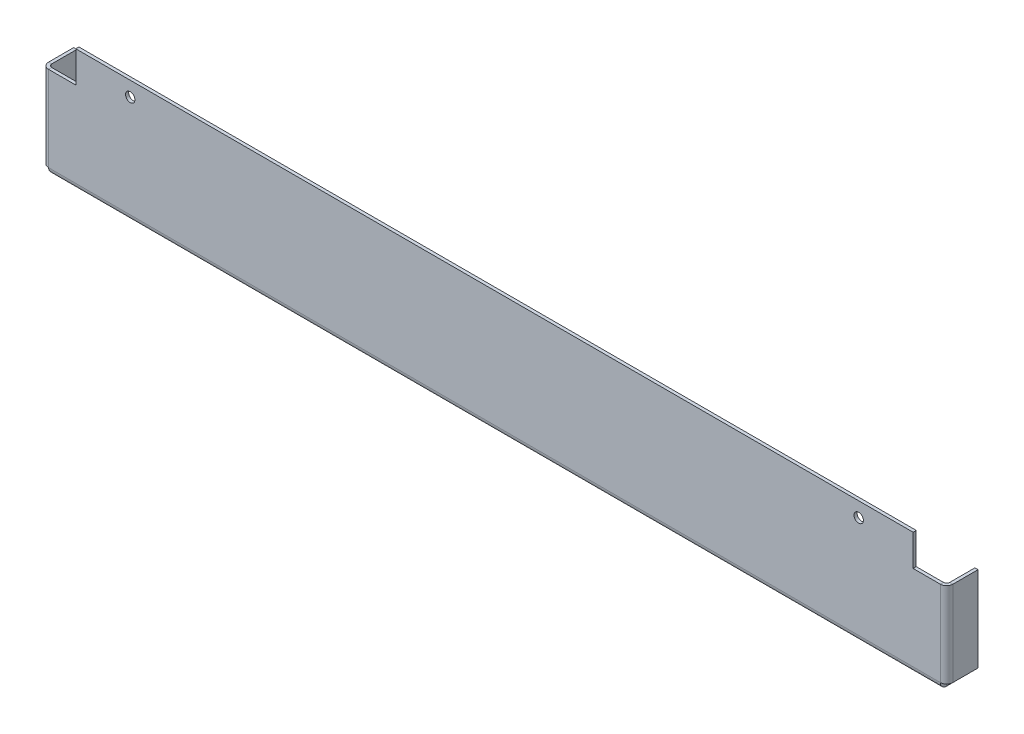
ISO-10303-21;
HEADER;
FILE_DESCRIPTION(('STEP AP214'),'2;1');
FILE_NAME('part.step','',(''),(''),'','','');
FILE_SCHEMA(('AUTOMOTIVE_DESIGN { 1 0 10303 214 1 1 1 1 }'));
ENDSEC;
DATA;
#1=APPLICATION_CONTEXT('core data for automotive mechanical design processes');
#2=APPLICATION_PROTOCOL_DEFINITION('international standard','automotive_design',2000,#1);
#3=PRODUCT_CONTEXT('',#1,'mechanical');
#4=PRODUCT('Part','Part','',(#3));
#5=PRODUCT_RELATED_PRODUCT_CATEGORY('part','',(#4));
#6=PRODUCT_DEFINITION_FORMATION('','',#4);
#7=PRODUCT_DEFINITION_CONTEXT('part definition',#1,'design');
#8=PRODUCT_DEFINITION('design','',#6,#7);
#9=PRODUCT_DEFINITION_SHAPE('','',#8);
#10=(LENGTH_UNIT() NAMED_UNIT(*) SI_UNIT(.MILLI.,.METRE.));
#11=(NAMED_UNIT(*) PLANE_ANGLE_UNIT() SI_UNIT($,.RADIAN.));
#12=(NAMED_UNIT(*) SI_UNIT($,.STERADIAN.) SOLID_ANGLE_UNIT());
#13=UNCERTAINTY_MEASURE_WITH_UNIT(LENGTH_MEASURE(1.E-05),#10,'distance_accuracy_value','');
#14=(GEOMETRIC_REPRESENTATION_CONTEXT(3) GLOBAL_UNCERTAINTY_ASSIGNED_CONTEXT((#13)) GLOBAL_UNIT_ASSIGNED_CONTEXT((#10,
#11,#12)) REPRESENTATION_CONTEXT('',''));
#15=CARTESIAN_POINT('',(0.,0.,0.));
#16=DIRECTION('',(0.,0.,1.));
#17=DIRECTION('',(1.,0.,0.));
#18=AXIS2_PLACEMENT_3D('',#15,#16,#17);
#19=CARTESIAN_POINT('',(413.,40.7,-15.0000000000001));
#20=DIRECTION('',(0.,-1.,0.));
#21=DIRECTION('',(1.,0.,0.));
#22=AXIS2_PLACEMENT_3D('',#19,#20,#21);
#23=PLANE('',#22);
#24=DIRECTION('',(0.,0.,1.));
#25=VECTOR('',#24,1.);
#26=CARTESIAN_POINT('',(427.5,40.7,1.7516852166308E-12));
#27=LINE('',#26,#25);
#28=CARTESIAN_POINT('',(427.5,40.7,-15.));
#29=VERTEX_POINT('',#28);
#30=CARTESIAN_POINT('',(427.5,40.7,-3.));
#31=VERTEX_POINT('',#30);
#32=EDGE_CURVE('E298',#29,#31,#27,.T.);
#33=ORIENTED_EDGE('',*,*,#32,.T.);
#34=DIRECTION('',(1.,0.,0.));
#35=VECTOR('',#34,1.);
#36=CARTESIAN_POINT('',(427.5,40.7,-3.));
#37=LINE('',#36,#35);
#38=CARTESIAN_POINT('',(429.,40.7,-3.));
#39=VERTEX_POINT('',#38);
#40=EDGE_CURVE('E13',#31,#39,#37,.T.);
#41=ORIENTED_EDGE('',*,*,#40,.T.);
#42=DIRECTION('',(0.,0.,-1.));
#43=VECTOR('',#42,1.);
#44=CARTESIAN_POINT('',(429.,40.7,-15.));
#45=LINE('',#44,#43);
#46=CARTESIAN_POINT('',(429.,40.7,-15.));
#47=VERTEX_POINT('',#46);
#48=EDGE_CURVE('E113',#39,#47,#45,.T.);
#49=ORIENTED_EDGE('',*,*,#48,.T.);
#50=DIRECTION('',(1.,0.,0.));
#51=VECTOR('',#50,1.);
#52=CARTESIAN_POINT('',(429.,40.7,-15.));
#53=LINE('',#52,#51);
#54=EDGE_CURVE('E282',#29,#47,#53,.T.);
#55=ORIENTED_EDGE('',*,*,#54,.F.);
#56=EDGE_LOOP('',(#33,#41,#49,#55));
#57=FACE_BOUND('',#56,.T.);
#58=ADVANCED_FACE('F99',(#57),#23,.F.);
#59=DIRECTION('',(1.,0.,0.));
#60=VECTOR('',#59,1.);
#61=CARTESIAN_POINT('',(413.,40.7,1.69810756928375E-12));
#62=LINE('',#61,#60);
#63=CARTESIAN_POINT('',(413.,40.7,1.69810756928375E-12));
#64=VERTEX_POINT('',#63);
#65=CARTESIAN_POINT('',(426.,40.7,1.75156275195089E-12));
#66=VERTEX_POINT('',#65);
#67=EDGE_CURVE('E254',#64,#66,#62,.T.);
#68=ORIENTED_EDGE('',*,*,#67,.T.);
#69=DIRECTION('',(0.,0.,-1.));
#70=VECTOR('',#69,1.);
#71=CARTESIAN_POINT('',(426.,40.7,1.75156275195089E-12));
#72=LINE('',#71,#70);
#73=CARTESIAN_POINT('',(426.,40.7,-1.50000000000001));
#74=VERTEX_POINT('',#73);
#75=EDGE_CURVE('E107',#66,#74,#72,.T.);
#76=ORIENTED_EDGE('',*,*,#75,.T.);
#77=DIRECTION('',(-1.,0.,0.));
#78=VECTOR('',#77,1.);
#79=CARTESIAN_POINT('',(0.,40.7,-1.5));
#80=LINE('',#79,#78);
#81=CARTESIAN_POINT('',(413.,40.7,-1.5));
#82=VERTEX_POINT('',#81);
#83=EDGE_CURVE('E287',#74,#82,#80,.T.);
#84=ORIENTED_EDGE('',*,*,#83,.T.);
#85=DIRECTION('',(0.,0.,-1.));
#86=VECTOR('',#85,1.);
#87=CARTESIAN_POINT('',(413.,40.7,-15.0000000000001));
#88=LINE('',#87,#86);
#89=EDGE_CURVE('E255',#64,#82,#88,.T.);
#90=ORIENTED_EDGE('',*,*,#89,.F.);
#91=EDGE_LOOP('',(#68,#76,#84,#90));
#92=FACE_BOUND('',#91,.T.);
#93=ADVANCED_FACE('F285',(#92),#23,.F.);
#94=CARTESIAN_POINT('',(13.,40.7,-15.0000000000001));
#95=DIRECTION('',(0.,-1.,0.));
#96=DIRECTION('',(0.,0.,-1.));
#97=AXIS2_PLACEMENT_3D('',#94,#95,#96);
#98=PLANE('',#97);
#99=DIRECTION('',(-1.,0.,0.));
#100=VECTOR('',#99,1.);
#101=CARTESIAN_POINT('',(0.,40.7,-1.5));
#102=LINE('',#101,#100);
#103=CARTESIAN_POINT('',(13.,40.7,-1.5));
#104=VERTEX_POINT('',#103);
#105=CARTESIAN_POINT('',(0.,40.7,-1.5));
#106=VERTEX_POINT('',#105);
#107=EDGE_CURVE('E451',#104,#106,#102,.T.);
#108=ORIENTED_EDGE('',*,*,#107,.T.);
#109=DIRECTION('',(0.,0.,1.));
#110=VECTOR('',#109,1.);
#111=CARTESIAN_POINT('',(0.,40.7,-1.5));
#112=LINE('',#111,#110);
#113=CARTESIAN_POINT('',(0.,40.7,0.));
#114=VERTEX_POINT('',#113);
#115=EDGE_CURVE('E280',#106,#114,#112,.T.);
#116=ORIENTED_EDGE('',*,*,#115,.T.);
#117=DIRECTION('',(-1.,0.,0.));
#118=VECTOR('',#117,1.);
#119=CARTESIAN_POINT('',(13.,40.7,0.));
#120=LINE('',#119,#118);
#121=CARTESIAN_POINT('',(13.,40.7,0.));
#122=VERTEX_POINT('',#121);
#123=EDGE_CURVE('E458',#122,#114,#120,.T.);
#124=ORIENTED_EDGE('',*,*,#123,.F.);
#125=DIRECTION('',(0.,0.,1.));
#126=VECTOR('',#125,1.);
#127=CARTESIAN_POINT('',(13.,40.7,-15.0000000000001));
#128=LINE('',#127,#126);
#129=EDGE_CURVE('E463',#104,#122,#128,.T.);
#130=ORIENTED_EDGE('',*,*,#129,.F.);
#131=EDGE_LOOP('',(#108,#116,#124,#130));
#132=FACE_BOUND('',#131,.T.);
#133=ADVANCED_FACE('F509',(#132),#98,.F.);
#134=DIRECTION('',(0.,0.,1.));
#135=VECTOR('',#134,1.);
#136=CARTESIAN_POINT('',(-3.00000000000004,40.7,-15.));
#137=LINE('',#136,#135);
#138=CARTESIAN_POINT('',(-3.00000000000004,40.7,-15.));
#139=VERTEX_POINT('',#138);
#140=CARTESIAN_POINT('',(-3.,40.7,-2.99999999999999));
#141=VERTEX_POINT('',#140);
#142=EDGE_CURVE('E460',#139,#141,#137,.T.);
#143=ORIENTED_EDGE('',*,*,#142,.T.);
#144=DIRECTION('',(1.,0.,0.));
#145=VECTOR('',#144,1.);
#146=CARTESIAN_POINT('',(-3.,40.7,-2.99999999999999));
#147=LINE('',#146,#145);
#148=CARTESIAN_POINT('',(-1.5,40.7,-2.99999999999999));
#149=VERTEX_POINT('',#148);
#150=EDGE_CURVE('E278',#141,#149,#147,.T.);
#151=ORIENTED_EDGE('',*,*,#150,.T.);
#152=DIRECTION('',(0.,0.,-1.));
#153=VECTOR('',#152,1.);
#154=CARTESIAN_POINT('',(-1.49999999999999,40.7,0.));
#155=LINE('',#154,#153);
#156=CARTESIAN_POINT('',(-1.50000000000004,40.7,-15.));
#157=VERTEX_POINT('',#156);
#158=EDGE_CURVE('E121',#149,#157,#155,.T.);
#159=ORIENTED_EDGE('',*,*,#158,.T.);
#160=DIRECTION('',(1.,0.,0.));
#161=VECTOR('',#160,1.);
#162=CARTESIAN_POINT('',(-3.00000000000004,40.7,-15.));
#163=LINE('',#162,#161);
#164=EDGE_CURVE('E272',#139,#157,#163,.T.);
#165=ORIENTED_EDGE('',*,*,#164,.F.);
#166=EDGE_LOOP('',(#143,#151,#159,#165));
#167=FACE_BOUND('',#166,.T.);
#168=ADVANCED_FACE('F524',(#167),#98,.F.);
#169=CARTESIAN_POINT('',(0.,55.7,-1.5));
#170=DIRECTION('',(0.,1.,0.));
#171=DIRECTION('',(0.,0.,1.));
#172=AXIS2_PLACEMENT_3D('',#169,#170,#171);
#173=PLANE('',#172);
#174=DIRECTION('',(0.,0.,1.));
#175=VECTOR('',#174,1.);
#176=CARTESIAN_POINT('',(413.,55.7,-15.0000000000001));
#177=LINE('',#176,#175);
#178=CARTESIAN_POINT('',(413.,55.7,-1.5));
#179=VERTEX_POINT('',#178);
#180=CARTESIAN_POINT('',(413.,55.7,1.69845474536632E-12));
#181=VERTEX_POINT('',#180);
#182=EDGE_CURVE('E234',#179,#181,#177,.T.);
#183=ORIENTED_EDGE('',*,*,#182,.F.);
#184=DIRECTION('',(-1.,0.,0.));
#185=VECTOR('',#184,1.);
#186=CARTESIAN_POINT('',(0.,55.7,-1.5));
#187=LINE('',#186,#185);
#188=CARTESIAN_POINT('',(13.,55.7,-1.5));
#189=VERTEX_POINT('',#188);
#190=EDGE_CURVE('E276',#179,#189,#187,.T.);
#191=ORIENTED_EDGE('',*,*,#190,.T.);
#192=DIRECTION('',(0.,0.,-1.));
#193=VECTOR('',#192,1.);
#194=CARTESIAN_POINT('',(13.,55.7,-15.0000000000001));
#195=LINE('',#194,#193);
#196=CARTESIAN_POINT('',(13.,55.7,0.));
#197=VERTEX_POINT('',#196);
#198=EDGE_CURVE('E259',#197,#189,#195,.T.);
#199=ORIENTED_EDGE('',*,*,#198,.F.);
#200=DIRECTION('',(-1.,0.,0.));
#201=VECTOR('',#200,1.);
#202=CARTESIAN_POINT('',(0.,55.7,0.));
#203=LINE('',#202,#201);
#204=EDGE_CURVE('E251',#181,#197,#203,.T.);
#205=ORIENTED_EDGE('',*,*,#204,.F.);
#206=EDGE_LOOP('',(#183,#191,#199,#205));
#207=FACE_BOUND('',#206,.T.);
#208=ADVANCED_FACE('F101',(#207),#173,.T.);
#209=CARTESIAN_POINT('',(0.,0.,-1.5));
#210=DIRECTION('',(0.,0.,-1.));
#211=DIRECTION('',(-1.,0.,0.));
#212=AXIS2_PLACEMENT_3D('',#209,#210,#211);
#213=PLANE('',#212);
#214=CARTESIAN_POINT('',(387.,48.7,-1.5));
#215=DIRECTION('',(0.,0.,-1.));
#216=DIRECTION('',(-1.,0.,0.));
#217=AXIS2_PLACEMENT_3D('',#214,#215,#216);
#218=CIRCLE('',#217,2.24999999999995);
#219=CARTESIAN_POINT('',(384.75,48.7,-1.5));
#220=VERTEX_POINT('',#219);
#221=EDGE_CURVE('E480',#220,#220,#218,.T.);
#222=ORIENTED_EDGE('',*,*,#221,.F.);
#223=EDGE_LOOP('',(#222));
#224=FACE_BOUND('',#223,.T.);
#225=CARTESIAN_POINT('',(39.,48.7,-1.5));
#226=DIRECTION('',(0.,0.,-1.));
#227=DIRECTION('',(-1.,0.,0.));
#228=AXIS2_PLACEMENT_3D('',#225,#226,#227);
#229=CIRCLE('',#228,2.25000000000001);
#230=CARTESIAN_POINT('',(36.75,48.7,-1.5));
#231=VERTEX_POINT('',#230);
#232=EDGE_CURVE('E473',#231,#231,#229,.T.);
#233=ORIENTED_EDGE('',*,*,#232,.F.);
#234=EDGE_LOOP('',(#233));
#235=FACE_BOUND('',#234,.T.);
#236=ORIENTED_EDGE('',*,*,#83,.F.);
#237=DIRECTION('',(0.,1.,0.));
#238=VECTOR('',#237,1.);
#239=CARTESIAN_POINT('',(426.,0.,-1.5));
#240=LINE('',#239,#238);
#241=CARTESIAN_POINT('',(426.,0.,-1.50000000000001));
#242=VERTEX_POINT('',#241);
#243=EDGE_CURVE('E304',#242,#74,#240,.T.);
#244=ORIENTED_EDGE('',*,*,#243,.F.);
#245=DIRECTION('',(1.,0.,0.));
#246=VECTOR('',#245,1.);
#247=CARTESIAN_POINT('',(0.,0.,-1.5));
#248=LINE('',#247,#246);
#249=CARTESIAN_POINT('',(0.,0.,-1.49999999999999));
#250=VERTEX_POINT('',#249);
#251=EDGE_CURVE('E263',#250,#242,#248,.T.);
#252=ORIENTED_EDGE('',*,*,#251,.F.);
#253=DIRECTION('',(0.,-1.,0.));
#254=VECTOR('',#253,1.);
#255=CARTESIAN_POINT('',(0.,0.,-1.5));
#256=LINE('',#255,#254);
#257=EDGE_CURVE('E260',#106,#250,#256,.T.);
#258=ORIENTED_EDGE('',*,*,#257,.F.);
#259=ORIENTED_EDGE('',*,*,#107,.F.);
#260=DIRECTION('',(0.,1.,0.));
#261=VECTOR('',#260,1.);
#262=CARTESIAN_POINT('',(13.,0.,-1.5));
#263=LINE('',#262,#261);
#264=EDGE_CURVE('E428',#104,#189,#263,.T.);
#265=ORIENTED_EDGE('',*,*,#264,.T.);
#266=ORIENTED_EDGE('',*,*,#190,.F.);
#267=DIRECTION('',(0.,1.,0.));
#268=VECTOR('',#267,1.);
#269=CARTESIAN_POINT('',(413.,0.,-1.5));
#270=LINE('',#269,#268);
#271=EDGE_CURVE('E241',#82,#179,#270,.T.);
#272=ORIENTED_EDGE('',*,*,#271,.F.);
#273=EDGE_LOOP('',(#236,#244,#252,#258,#259,#265,#266,#272));
#274=FACE_BOUND('',#273,.T.);
#275=ADVANCED_FACE('F302',(#224,#235,#274),#213,.T.);
#276=CARTESIAN_POINT('',(0.,0.,0.));
#277=DIRECTION('',(0.,0.,-1.));
#278=DIRECTION('',(-1.,0.,0.));
#279=AXIS2_PLACEMENT_3D('',#276,#277,#278);
#280=PLANE('',#279);
#281=CARTESIAN_POINT('',(387.,48.7,0.));
#282=DIRECTION('',(0.,0.,1.));
#283=DIRECTION('',(1.,0.,0.));
#284=AXIS2_PLACEMENT_3D('',#281,#282,#283);
#285=CIRCLE('',#284,2.24999999999995);
#286=CARTESIAN_POINT('',(389.25,48.7,0.));
#287=VERTEX_POINT('',#286);
#288=EDGE_CURVE('E483',#287,#287,#285,.T.);
#289=ORIENTED_EDGE('',*,*,#288,.F.);
#290=EDGE_LOOP('',(#289));
#291=FACE_BOUND('',#290,.T.);
#292=CARTESIAN_POINT('',(39.,48.7,0.));
#293=DIRECTION('',(0.,0.,1.));
#294=DIRECTION('',(1.,0.,0.));
#295=AXIS2_PLACEMENT_3D('',#292,#293,#294);
#296=CIRCLE('',#295,2.25000000000001);
#297=CARTESIAN_POINT('',(41.25,48.7,0.));
#298=VERTEX_POINT('',#297);
#299=EDGE_CURVE('E477',#298,#298,#296,.T.);
#300=ORIENTED_EDGE('',*,*,#299,.F.);
#301=EDGE_LOOP('',(#300));
#302=FACE_BOUND('',#301,.T.);
#303=DIRECTION('',(0.,1.,0.));
#304=VECTOR('',#303,1.);
#305=CARTESIAN_POINT('',(426.,0.,0.));
#306=LINE('',#305,#304);
#307=CARTESIAN_POINT('',(426.,0.,0.));
#308=VERTEX_POINT('',#307);
#309=EDGE_CURVE('E261',#308,#66,#306,.T.);
#310=ORIENTED_EDGE('',*,*,#309,.T.);
#311=ORIENTED_EDGE('',*,*,#67,.F.);
#312=DIRECTION('',(0.,-1.,0.));
#313=VECTOR('',#312,1.);
#314=CARTESIAN_POINT('',(413.,55.7,1.69845474536632E-12));
#315=LINE('',#314,#313);
#316=EDGE_CURVE('E238',#181,#64,#315,.T.);
#317=ORIENTED_EDGE('',*,*,#316,.F.);
#318=ORIENTED_EDGE('',*,*,#204,.T.);
#319=DIRECTION('',(0.,1.,0.));
#320=VECTOR('',#319,1.);
#321=CARTESIAN_POINT('',(13.,55.7,0.));
#322=LINE('',#321,#320);
#323=EDGE_CURVE('E465',#122,#197,#322,.T.);
#324=ORIENTED_EDGE('',*,*,#323,.F.);
#325=ORIENTED_EDGE('',*,*,#123,.T.);
#326=DIRECTION('',(0.,-1.,0.));
#327=VECTOR('',#326,1.);
#328=CARTESIAN_POINT('',(0.,0.,0.));
#329=LINE('',#328,#327);
#330=CARTESIAN_POINT('',(0.,0.,0.));
#331=VERTEX_POINT('',#330);
#332=EDGE_CURVE('E316',#114,#331,#329,.T.);
#333=ORIENTED_EDGE('',*,*,#332,.T.);
#334=DIRECTION('',(1.,0.,0.));
#335=VECTOR('',#334,1.);
#336=CARTESIAN_POINT('',(0.,0.,0.));
#337=LINE('',#336,#335);
#338=EDGE_CURVE('E265',#331,#308,#337,.T.);
#339=ORIENTED_EDGE('',*,*,#338,.T.);
#340=EDGE_LOOP('',(#310,#311,#317,#318,#324,#325,#333,#339));
#341=FACE_BOUND('',#340,.T.);
#342=ADVANCED_FACE('F249',(#291,#302,#341),#280,.F.);
#343=CARTESIAN_POINT('',(0.,0.,-3.));
#344=DIRECTION('',(0.,-1.,0.));
#345=DIRECTION('',(1.,0.,0.));
#346=AXIS2_PLACEMENT_3D('',#343,#344,#345);
#347=PLANE('',#346);
#348=DIRECTION('',(1.,0.,0.));
#349=VECTOR('',#348,1.);
#350=CARTESIAN_POINT('',(-3.,0.,-2.99999999999999));
#351=LINE('',#350,#349);
#352=CARTESIAN_POINT('',(-1.5,0.,-2.99999999999999));
#353=VERTEX_POINT('',#352);
#354=CARTESIAN_POINT('',(-3.,0.,-2.99999999999999));
#355=VERTEX_POINT('',#354);
#356=EDGE_CURVE('E354',#353,#355,#351,.F.);
#357=ORIENTED_EDGE('',*,*,#356,.F.);
#358=CARTESIAN_POINT('',(0.,0.,-3.));
#359=DIRECTION('',(0.,1.,0.));
#360=DIRECTION('',(-1.,0.,0.));
#361=AXIS2_PLACEMENT_3D('',#358,#359,#360);
#362=CIRCLE('',#361,1.5);
#363=EDGE_CURVE('E349',#250,#353,#362,.F.);
#364=ORIENTED_EDGE('',*,*,#363,.F.);
#365=DIRECTION('',(0.,0.,1.));
#366=VECTOR('',#365,1.);
#367=CARTESIAN_POINT('',(0.,0.,-1.5));
#368=LINE('',#367,#366);
#369=EDGE_CURVE('E273',#250,#331,#368,.T.);
#370=ORIENTED_EDGE('',*,*,#369,.T.);
#371=CARTESIAN_POINT('',(0.,0.,-3.));
#372=DIRECTION('',(0.,1.,0.));
#373=DIRECTION('',(-1.,0.,0.));
#374=AXIS2_PLACEMENT_3D('',#371,#372,#373);
#375=CIRCLE('',#374,3.);
#376=EDGE_CURVE('E317',#331,#355,#375,.F.);
#377=ORIENTED_EDGE('',*,*,#376,.T.);
#378=EDGE_LOOP('',(#357,#364,#370,#377));
#379=FACE_BOUND('',#378,.T.);
#380=ADVANCED_FACE('F352',(#379),#347,.T.);
#381=CARTESIAN_POINT('',(0.,55.7,-3.));
#382=DIRECTION('',(0.,1.,0.));
#383=DIRECTION('',(-1.,0.,0.));
#384=AXIS2_PLACEMENT_3D('',#381,#382,#383);
#385=CYLINDRICAL_SURFACE('',#384,3.);
#386=CARTESIAN_POINT('',(0.,40.7,-3.));
#387=DIRECTION('',(0.,-1.,0.));
#388=DIRECTION('',(0.,0.,-1.));
#389=AXIS2_PLACEMENT_3D('',#386,#387,#388);
#390=CIRCLE('',#389,3.);
#391=EDGE_CURVE('E448',#141,#114,#390,.F.);
#392=ORIENTED_EDGE('',*,*,#391,.F.);
#393=DIRECTION('',(0.,1.,0.));
#394=VECTOR('',#393,1.);
#395=CARTESIAN_POINT('',(-3.,0.,-2.99999999999999));
#396=LINE('',#395,#394);
#397=EDGE_CURVE('E346',#141,#355,#396,.F.);
#398=ORIENTED_EDGE('',*,*,#397,.T.);
#399=ORIENTED_EDGE('',*,*,#376,.F.);
#400=ORIENTED_EDGE('',*,*,#332,.F.);
#401=EDGE_LOOP('',(#392,#398,#399,#400));
#402=FACE_BOUND('',#401,.T.);
#403=ADVANCED_FACE('F344',(#402),#385,.T.);
#404=CARTESIAN_POINT('',(0.,55.7,-3.));
#405=DIRECTION('',(0.,1.,0.));
#406=DIRECTION('',(-1.,0.,0.));
#407=AXIS2_PLACEMENT_3D('',#404,#405,#406);
#408=CYLINDRICAL_SURFACE('',#407,1.5);
#409=DIRECTION('',(0.,1.,0.));
#410=VECTOR('',#409,1.);
#411=CARTESIAN_POINT('',(-1.5,0.,-2.99999999999999));
#412=LINE('',#411,#410);
#413=EDGE_CURVE('E390',#353,#149,#412,.T.);
#414=ORIENTED_EDGE('',*,*,#413,.T.);
#415=CARTESIAN_POINT('',(0.,40.7,-3.));
#416=DIRECTION('',(0.,-1.,0.));
#417=DIRECTION('',(0.,0.,-1.));
#418=AXIS2_PLACEMENT_3D('',#415,#416,#417);
#419=CIRCLE('',#418,1.5);
#420=EDGE_CURVE('E454',#149,#106,#419,.F.);
#421=ORIENTED_EDGE('',*,*,#420,.T.);
#422=ORIENTED_EDGE('',*,*,#257,.T.);
#423=ORIENTED_EDGE('',*,*,#363,.T.);
#424=EDGE_LOOP('',(#414,#421,#422,#423));
#425=FACE_BOUND('',#424,.T.);
#426=ADVANCED_FACE('F591',(#425),#408,.F.);
#427=CARTESIAN_POINT('',(-2.99999999999999,0.,-1.49999999999999));
#428=DIRECTION('',(0.,1.,0.));
#429=DIRECTION('',(0.,0.,1.));
#430=AXIS2_PLACEMENT_3D('',#427,#428,#429);
#431=PLANE('',#430);
#432=ORIENTED_EDGE('',*,*,#356,.T.);
#433=DIRECTION('',(0.,0.,1.));
#434=VECTOR('',#433,1.);
#435=CARTESIAN_POINT('',(-2.99999999999999,0.,0.));
#436=LINE('',#435,#434);
#437=CARTESIAN_POINT('',(-3.00000000000004,0.,-15.));
#438=VERTEX_POINT('',#437);
#439=EDGE_CURVE('E379',#438,#355,#436,.T.);
#440=ORIENTED_EDGE('',*,*,#439,.F.);
#441=DIRECTION('',(1.,0.,0.));
#442=VECTOR('',#441,1.);
#443=CARTESIAN_POINT('',(-3.00000000000004,0.,-15.));
#444=LINE('',#443,#442);
#445=CARTESIAN_POINT('',(-1.50000000000004,0.,-15.));
#446=VERTEX_POINT('',#445);
#447=EDGE_CURVE('E358',#438,#446,#444,.T.);
#448=ORIENTED_EDGE('',*,*,#447,.T.);
#449=DIRECTION('',(0.,0.,-1.));
#450=VECTOR('',#449,1.);
#451=CARTESIAN_POINT('',(-1.49999999999999,0.,-1.5));
#452=LINE('',#451,#450);
#453=EDGE_CURVE('E384',#446,#353,#452,.F.);
#454=ORIENTED_EDGE('',*,*,#453,.T.);
#455=EDGE_LOOP('',(#432,#440,#448,#454));
#456=FACE_BOUND('',#455,.T.);
#457=ADVANCED_FACE('F584',(#456),#431,.F.);
#458=CARTESIAN_POINT('',(-2.99999999999999,0.,0.));
#459=DIRECTION('',(1.,0.,0.));
#460=DIRECTION('',(0.,0.,-1.));
#461=AXIS2_PLACEMENT_3D('',#458,#459,#460);
#462=PLANE('',#461);
#463=ORIENTED_EDGE('',*,*,#397,.F.);
#464=ORIENTED_EDGE('',*,*,#142,.F.);
#465=DIRECTION('',(0.,-1.,0.));
#466=VECTOR('',#465,1.);
#467=CARTESIAN_POINT('',(-3.00000000000004,0.,-15.));
#468=LINE('',#467,#466);
#469=EDGE_CURVE('E382',#139,#438,#468,.T.);
#470=ORIENTED_EDGE('',*,*,#469,.T.);
#471=ORIENTED_EDGE('',*,*,#439,.T.);
#472=EDGE_LOOP('',(#463,#464,#470,#471));
#473=FACE_BOUND('',#472,.T.);
#474=ADVANCED_FACE('F580',(#473),#462,.F.);
#475=CARTESIAN_POINT('',(-1.49999999999999,0.,0.));
#476=DIRECTION('',(1.,0.,0.));
#477=DIRECTION('',(0.,0.,-1.));
#478=AXIS2_PLACEMENT_3D('',#475,#476,#477);
#479=PLANE('',#478);
#480=ORIENTED_EDGE('',*,*,#158,.F.);
#481=ORIENTED_EDGE('',*,*,#413,.F.);
#482=ORIENTED_EDGE('',*,*,#453,.F.);
#483=DIRECTION('',(0.,1.,0.));
#484=VECTOR('',#483,1.);
#485=CARTESIAN_POINT('',(-1.50000000000004,0.,-15.));
#486=LINE('',#485,#484);
#487=EDGE_CURVE('E387',#157,#446,#486,.F.);
#488=ORIENTED_EDGE('',*,*,#487,.F.);
#489=EDGE_LOOP('',(#480,#481,#482,#488));
#490=FACE_BOUND('',#489,.T.);
#491=ADVANCED_FACE('F583',(#490),#479,.T.);
#492=CARTESIAN_POINT('',(-3.00000000000004,0.,-15.));
#493=DIRECTION('',(0.,0.,1.));
#494=DIRECTION('',(1.,0.,0.));
#495=AXIS2_PLACEMENT_3D('',#492,#493,#494);
#496=PLANE('',#495);
#497=ORIENTED_EDGE('',*,*,#469,.F.);
#498=ORIENTED_EDGE('',*,*,#164,.T.);
#499=ORIENTED_EDGE('',*,*,#487,.T.);
#500=ORIENTED_EDGE('',*,*,#447,.F.);
#501=EDGE_LOOP('',(#497,#498,#499,#500));
#502=FACE_BOUND('',#501,.T.);
#503=ADVANCED_FACE('F577',(#502),#496,.F.);
#504=CARTESIAN_POINT('',(426.,0.,-3.));
#505=DIRECTION('',(1.,0.,0.));
#506=DIRECTION('',(0.,1.,0.));
#507=AXIS2_PLACEMENT_3D('',#504,#505,#506);
#508=PLANE('',#507);
#509=DIRECTION('',(0.,1.,0.));
#510=VECTOR('',#509,1.);
#511=CARTESIAN_POINT('',(426.,-3.,-2.99999999999999));
#512=LINE('',#511,#510);
#513=CARTESIAN_POINT('',(426.,-1.5,-3.));
#514=VERTEX_POINT('',#513);
#515=CARTESIAN_POINT('',(426.,-3.,-2.99999999999999));
#516=VERTEX_POINT('',#515);
#517=EDGE_CURVE('E371',#514,#516,#512,.F.);
#518=ORIENTED_EDGE('',*,*,#517,.F.);
#519=CARTESIAN_POINT('',(426.,0.,-3.));
#520=DIRECTION('',(-1.,0.,0.));
#521=DIRECTION('',(0.,-1.,0.));
#522=AXIS2_PLACEMENT_3D('',#519,#520,#521);
#523=CIRCLE('',#522,1.50000000000002);
#524=EDGE_CURVE('E339',#242,#514,#523,.F.);
#525=ORIENTED_EDGE('',*,*,#524,.F.);
#526=DIRECTION('',(0.,0.,1.));
#527=VECTOR('',#526,1.);
#528=CARTESIAN_POINT('',(426.,0.,-1.5));
#529=LINE('',#528,#527);
#530=EDGE_CURVE('E269',#242,#308,#529,.T.);
#531=ORIENTED_EDGE('',*,*,#530,.T.);
#532=CARTESIAN_POINT('',(426.,0.,-3.));
#533=DIRECTION('',(-1.,0.,0.));
#534=DIRECTION('',(0.,-1.,0.));
#535=AXIS2_PLACEMENT_3D('',#532,#533,#534);
#536=CIRCLE('',#535,3.00000000000001);
#537=EDGE_CURVE('E329',#308,#516,#536,.F.);
#538=ORIENTED_EDGE('',*,*,#537,.T.);
#539=EDGE_LOOP('',(#518,#525,#531,#538));
#540=FACE_BOUND('',#539,.T.);
#541=ADVANCED_FACE('F369',(#540),#508,.T.);
#542=CARTESIAN_POINT('',(0.,0.,-3.));
#543=DIRECTION('',(1.,0.,0.));
#544=DIRECTION('',(0.,1.,0.));
#545=AXIS2_PLACEMENT_3D('',#542,#543,#544);
#546=PLANE('',#545);
#547=CARTESIAN_POINT('',(0.,0.,-3.));
#548=DIRECTION('',(-1.,0.,0.));
#549=DIRECTION('',(0.,-1.,0.));
#550=AXIS2_PLACEMENT_3D('',#547,#548,#549);
#551=CIRCLE('',#550,1.50000000000002);
#552=CARTESIAN_POINT('',(0.,-1.50000000000003,-3.));
#553=VERTEX_POINT('',#552);
#554=EDGE_CURVE('E367',#553,#250,#551,.T.);
#555=ORIENTED_EDGE('',*,*,#554,.F.);
#556=DIRECTION('',(0.,1.,0.));
#557=VECTOR('',#556,1.);
#558=CARTESIAN_POINT('',(0.,-1.5,-3.));
#559=LINE('',#558,#557);
#560=CARTESIAN_POINT('',(0.,-3.,-2.99999999999999));
#561=VERTEX_POINT('',#560);
#562=EDGE_CURVE('E337',#553,#561,#559,.F.);
#563=ORIENTED_EDGE('',*,*,#562,.T.);
#564=CARTESIAN_POINT('',(0.,0.,-3.));
#565=DIRECTION('',(-1.,0.,0.));
#566=DIRECTION('',(0.,-1.,0.));
#567=AXIS2_PLACEMENT_3D('',#564,#565,#566);
#568=CIRCLE('',#567,3.00000000000001);
#569=EDGE_CURVE('E326',#561,#331,#568,.T.);
#570=ORIENTED_EDGE('',*,*,#569,.T.);
#571=ORIENTED_EDGE('',*,*,#369,.F.);
#572=EDGE_LOOP('',(#555,#563,#570,#571));
#573=FACE_BOUND('',#572,.T.);
#574=ADVANCED_FACE('F334',(#573),#546,.F.);
#575=CARTESIAN_POINT('',(0.,0.,-3.));
#576=DIRECTION('',(-1.,0.,0.));
#577=DIRECTION('',(0.,-1.,0.));
#578=AXIS2_PLACEMENT_3D('',#575,#576,#577);
#579=CYLINDRICAL_SURFACE('',#578,3.00000000000001);
#580=ORIENTED_EDGE('',*,*,#338,.F.);
#581=ORIENTED_EDGE('',*,*,#569,.F.);
#582=DIRECTION('',(-1.,0.,0.));
#583=VECTOR('',#582,1.);
#584=CARTESIAN_POINT('',(426.,-3.,-2.99999999999999));
#585=LINE('',#584,#583);
#586=EDGE_CURVE('E400',#561,#516,#585,.F.);
#587=ORIENTED_EDGE('',*,*,#586,.T.);
#588=ORIENTED_EDGE('',*,*,#537,.F.);
#589=EDGE_LOOP('',(#580,#581,#587,#588));
#590=FACE_BOUND('',#589,.T.);
#591=ADVANCED_FACE('F325',(#590),#579,.T.);
#592=CARTESIAN_POINT('',(0.,0.,-3.));
#593=DIRECTION('',(-1.,0.,0.));
#594=DIRECTION('',(0.,-1.,0.));
#595=AXIS2_PLACEMENT_3D('',#592,#593,#594);
#596=CYLINDRICAL_SURFACE('',#595,1.50000000000002);
#597=ORIENTED_EDGE('',*,*,#251,.T.);
#598=ORIENTED_EDGE('',*,*,#524,.T.);
#599=DIRECTION('',(-1.,0.,0.));
#600=VECTOR('',#599,1.);
#601=CARTESIAN_POINT('',(426.,-1.5,-2.99999999999999));
#602=LINE('',#601,#600);
#603=EDGE_CURVE('E396',#514,#553,#602,.T.);
#604=ORIENTED_EDGE('',*,*,#603,.T.);
#605=ORIENTED_EDGE('',*,*,#554,.T.);
#606=EDGE_LOOP('',(#597,#598,#604,#605));
#607=FACE_BOUND('',#606,.T.);
#608=ADVANCED_FACE('F365',(#607),#596,.F.);
#609=CARTESIAN_POINT('',(0.,-3.00000000000004,-15.));
#610=DIRECTION('',(1.,0.,0.));
#611=DIRECTION('',(0.,0.,-1.));
#612=AXIS2_PLACEMENT_3D('',#609,#610,#611);
#613=PLANE('',#612);
#614=ORIENTED_EDGE('',*,*,#562,.F.);
#615=DIRECTION('',(0.,0.,1.));
#616=VECTOR('',#615,1.);
#617=CARTESIAN_POINT('',(0.,-1.50000000000004,-15.));
#618=LINE('',#617,#616);
#619=CARTESIAN_POINT('',(0.,-1.50000000000004,-15.));
#620=VERTEX_POINT('',#619);
#621=EDGE_CURVE('E402',#553,#620,#618,.F.);
#622=ORIENTED_EDGE('',*,*,#621,.T.);
#623=DIRECTION('',(0.,1.,0.));
#624=VECTOR('',#623,1.);
#625=CARTESIAN_POINT('',(0.,-3.00000000000004,-15.));
#626=LINE('',#625,#624);
#627=CARTESIAN_POINT('',(0.,-3.00000000000004,-15.));
#628=VERTEX_POINT('',#627);
#629=EDGE_CURVE('E373',#628,#620,#626,.T.);
#630=ORIENTED_EDGE('',*,*,#629,.F.);
#631=DIRECTION('',(0.,0.,-1.));
#632=VECTOR('',#631,1.);
#633=CARTESIAN_POINT('',(0.,-2.99999999999999,0.));
#634=LINE('',#633,#632);
#635=EDGE_CURVE('E409',#561,#628,#634,.T.);
#636=ORIENTED_EDGE('',*,*,#635,.F.);
#637=EDGE_LOOP('',(#614,#622,#630,#636));
#638=FACE_BOUND('',#637,.T.);
#639=ADVANCED_FACE('F563',(#638),#613,.F.);
#640=CARTESIAN_POINT('',(426.,-2.99999999999999,-1.49999999999999));
#641=DIRECTION('',(-1.,0.,0.));
#642=DIRECTION('',(0.,-1.,0.));
#643=AXIS2_PLACEMENT_3D('',#640,#641,#642);
#644=PLANE('',#643);
#645=ORIENTED_EDGE('',*,*,#517,.T.);
#646=DIRECTION('',(0.,0.,1.));
#647=VECTOR('',#646,1.);
#648=CARTESIAN_POINT('',(426.,-2.99999999999999,0.));
#649=LINE('',#648,#647);
#650=CARTESIAN_POINT('',(426.,-3.00000000000004,-15.));
#651=VERTEX_POINT('',#650);
#652=EDGE_CURVE('E413',#651,#516,#649,.T.);
#653=ORIENTED_EDGE('',*,*,#652,.F.);
#654=DIRECTION('',(0.,1.,0.));
#655=VECTOR('',#654,1.);
#656=CARTESIAN_POINT('',(426.,-3.00000000000004,-15.));
#657=LINE('',#656,#655);
#658=CARTESIAN_POINT('',(426.,-1.50000000000004,-15.));
#659=VERTEX_POINT('',#658);
#660=EDGE_CURVE('E416',#651,#659,#657,.T.);
#661=ORIENTED_EDGE('',*,*,#660,.T.);
#662=DIRECTION('',(0.,0.,-1.));
#663=VECTOR('',#662,1.);
#664=CARTESIAN_POINT('',(426.,-1.49999999999999,-1.5));
#665=LINE('',#664,#663);
#666=EDGE_CURVE('E406',#659,#514,#665,.F.);
#667=ORIENTED_EDGE('',*,*,#666,.T.);
#668=EDGE_LOOP('',(#645,#653,#661,#667));
#669=FACE_BOUND('',#668,.T.);
#670=ADVANCED_FACE('F556',(#669),#644,.F.);
#671=CARTESIAN_POINT('',(0.,-2.99999999999999,0.));
#672=DIRECTION('',(0.,1.,0.));
#673=DIRECTION('',(0.,0.,1.));
#674=AXIS2_PLACEMENT_3D('',#671,#672,#673);
#675=PLANE('',#674);
#676=ORIENTED_EDGE('',*,*,#586,.F.);
#677=ORIENTED_EDGE('',*,*,#635,.T.);
#678=DIRECTION('',(1.,0.,0.));
#679=VECTOR('',#678,1.);
#680=CARTESIAN_POINT('',(0.,-3.00000000000004,-15.));
#681=LINE('',#680,#679);
#682=EDGE_CURVE('E411',#628,#651,#681,.T.);
#683=ORIENTED_EDGE('',*,*,#682,.T.);
#684=ORIENTED_EDGE('',*,*,#652,.T.);
#685=EDGE_LOOP('',(#676,#677,#683,#684));
#686=FACE_BOUND('',#685,.T.);
#687=ADVANCED_FACE('F552',(#686),#675,.F.);
#688=CARTESIAN_POINT('',(0.,-1.49999999999999,0.));
#689=DIRECTION('',(0.,1.,0.));
#690=DIRECTION('',(0.,0.,1.));
#691=AXIS2_PLACEMENT_3D('',#688,#689,#690);
#692=PLANE('',#691);
#693=ORIENTED_EDGE('',*,*,#621,.F.);
#694=ORIENTED_EDGE('',*,*,#603,.F.);
#695=ORIENTED_EDGE('',*,*,#666,.F.);
#696=DIRECTION('',(-1.,0.,0.));
#697=VECTOR('',#696,1.);
#698=CARTESIAN_POINT('',(426.,-1.50000000000004,-15.));
#699=LINE('',#698,#697);
#700=EDGE_CURVE('E404',#620,#659,#699,.F.);
#701=ORIENTED_EDGE('',*,*,#700,.F.);
#702=EDGE_LOOP('',(#693,#694,#695,#701));
#703=FACE_BOUND('',#702,.T.);
#704=ADVANCED_FACE('F555',(#703),#692,.T.);
#705=CARTESIAN_POINT('',(426.,-3.00000000000004,-15.));
#706=DIRECTION('',(0.,0.,1.));
#707=DIRECTION('',(0.,-1.,0.));
#708=AXIS2_PLACEMENT_3D('',#705,#706,#707);
#709=PLANE('',#708);
#710=ORIENTED_EDGE('',*,*,#700,.T.);
#711=ORIENTED_EDGE('',*,*,#660,.F.);
#712=ORIENTED_EDGE('',*,*,#682,.F.);
#713=ORIENTED_EDGE('',*,*,#629,.T.);
#714=EDGE_LOOP('',(#710,#711,#712,#713));
#715=FACE_BOUND('',#714,.T.);
#716=ADVANCED_FACE('F550',(#715),#709,.F.);
#717=CARTESIAN_POINT('',(426.,0.,-3.00000000000001));
#718=DIRECTION('',(0.,1.,0.));
#719=DIRECTION('',(0.,0.,1.));
#720=AXIS2_PLACEMENT_3D('',#717,#718,#719);
#721=PLANE('',#720);
#722=CARTESIAN_POINT('',(426.,0.,-3.00000000000001));
#723=DIRECTION('',(0.,-1.,0.));
#724=DIRECTION('',(0.,0.,-1.));
#725=AXIS2_PLACEMENT_3D('',#722,#723,#724);
#726=CIRCLE('',#725,1.5);
#727=CARTESIAN_POINT('',(427.5,0.,-3.));
#728=VERTEX_POINT('',#727);
#729=EDGE_CURVE('E310',#728,#242,#726,.T.);
#730=ORIENTED_EDGE('',*,*,#729,.F.);
#731=DIRECTION('',(-1.,0.,0.));
#732=VECTOR('',#731,1.);
#733=CARTESIAN_POINT('',(427.5,0.,-3.));
#734=LINE('',#733,#732);
#735=CARTESIAN_POINT('',(429.,0.,-3.));
#736=VERTEX_POINT('',#735);
#737=EDGE_CURVE('E427',#728,#736,#734,.F.);
#738=ORIENTED_EDGE('',*,*,#737,.T.);
#739=CARTESIAN_POINT('',(426.,0.,-3.00000000000001));
#740=DIRECTION('',(0.,-1.,0.));
#741=DIRECTION('',(0.,0.,-1.));
#742=AXIS2_PLACEMENT_3D('',#739,#740,#741);
#743=CIRCLE('',#742,3.);
#744=EDGE_CURVE('E397',#736,#308,#743,.T.);
#745=ORIENTED_EDGE('',*,*,#744,.T.);
#746=ORIENTED_EDGE('',*,*,#530,.F.);
#747=EDGE_LOOP('',(#730,#738,#745,#746));
#748=FACE_BOUND('',#747,.T.);
#749=ADVANCED_FACE('F544',(#748),#721,.F.);
#750=CARTESIAN_POINT('',(426.,0.,-3.00000000000001));
#751=DIRECTION('',(0.,-1.,0.));
#752=DIRECTION('',(1.,0.,0.));
#753=AXIS2_PLACEMENT_3D('',#750,#751,#752);
#754=CYLINDRICAL_SURFACE('',#753,3.);
#755=CARTESIAN_POINT('',(426.,40.7,-3.00000000000001));
#756=DIRECTION('',(0.,-1.,0.));
#757=DIRECTION('',(1.,0.,0.));
#758=AXIS2_PLACEMENT_3D('',#755,#756,#757);
#759=CIRCLE('',#758,3.);
#760=EDGE_CURVE('E305',#66,#39,#759,.F.);
#761=ORIENTED_EDGE('',*,*,#760,.F.);
#762=ORIENTED_EDGE('',*,*,#309,.F.);
#763=ORIENTED_EDGE('',*,*,#744,.F.);
#764=DIRECTION('',(0.,-1.,0.));
#765=VECTOR('',#764,1.);
#766=CARTESIAN_POINT('',(429.,55.7,-3.));
#767=LINE('',#766,#765);
#768=EDGE_CURVE('E431',#736,#39,#767,.F.);
#769=ORIENTED_EDGE('',*,*,#768,.T.);
#770=EDGE_LOOP('',(#761,#762,#763,#769));
#771=FACE_BOUND('',#770,.T.);
#772=ADVANCED_FACE('F541',(#771),#754,.T.);
#773=CARTESIAN_POINT('',(426.,0.,-3.00000000000001));
#774=DIRECTION('',(0.,-1.,0.));
#775=DIRECTION('',(1.,0.,0.));
#776=AXIS2_PLACEMENT_3D('',#773,#774,#775);
#777=CYLINDRICAL_SURFACE('',#776,1.5);
#778=ORIENTED_EDGE('',*,*,#243,.T.);
#779=CARTESIAN_POINT('',(426.,40.7,-3.00000000000001));
#780=DIRECTION('',(0.,-1.,0.));
#781=DIRECTION('',(1.,0.,0.));
#782=AXIS2_PLACEMENT_3D('',#779,#780,#781);
#783=CIRCLE('',#782,1.5);
#784=EDGE_CURVE('E292',#74,#31,#783,.F.);
#785=ORIENTED_EDGE('',*,*,#784,.T.);
#786=DIRECTION('',(0.,-1.,0.));
#787=VECTOR('',#786,1.);
#788=CARTESIAN_POINT('',(427.5,55.7,-3.));
#789=LINE('',#788,#787);
#790=EDGE_CURVE('E425',#31,#728,#789,.T.);
#791=ORIENTED_EDGE('',*,*,#790,.T.);
#792=ORIENTED_EDGE('',*,*,#729,.T.);
#793=EDGE_LOOP('',(#778,#785,#791,#792));
#794=FACE_BOUND('',#793,.T.);
#795=ADVANCED_FACE('F308',(#794),#777,.F.);
#796=CARTESIAN_POINT('',(429.,0.,-15.));
#797=DIRECTION('',(0.,1.,0.));
#798=DIRECTION('',(0.,0.,1.));
#799=AXIS2_PLACEMENT_3D('',#796,#797,#798);
#800=PLANE('',#799);
#801=ORIENTED_EDGE('',*,*,#737,.F.);
#802=DIRECTION('',(0.,0.,1.));
#803=VECTOR('',#802,1.);
#804=CARTESIAN_POINT('',(427.5,0.,-15.));
#805=LINE('',#804,#803);
#806=CARTESIAN_POINT('',(427.5,0.,-15.));
#807=VERTEX_POINT('',#806);
#808=EDGE_CURVE('E434',#728,#807,#805,.F.);
#809=ORIENTED_EDGE('',*,*,#808,.T.);
#810=DIRECTION('',(-1.,0.,0.));
#811=VECTOR('',#810,1.);
#812=CARTESIAN_POINT('',(429.,0.,-15.));
#813=LINE('',#812,#811);
#814=CARTESIAN_POINT('',(429.,0.,-15.));
#815=VERTEX_POINT('',#814);
#816=EDGE_CURVE('E422',#815,#807,#813,.T.);
#817=ORIENTED_EDGE('',*,*,#816,.F.);
#818=DIRECTION('',(0.,0.,-1.));
#819=VECTOR('',#818,1.);
#820=CARTESIAN_POINT('',(429.,0.,1.75692243863907E-12));
#821=LINE('',#820,#819);
#822=EDGE_CURVE('E439',#736,#815,#821,.T.);
#823=ORIENTED_EDGE('',*,*,#822,.F.);
#824=EDGE_LOOP('',(#801,#809,#817,#823));
#825=FACE_BOUND('',#824,.T.);
#826=ADVANCED_FACE('F530',(#825),#800,.F.);
#827=CARTESIAN_POINT('',(429.,0.,1.75692243863907E-12));
#828=DIRECTION('',(-1.,0.,0.));
#829=DIRECTION('',(0.,0.,1.));
#830=AXIS2_PLACEMENT_3D('',#827,#828,#829);
#831=PLANE('',#830);
#832=DIRECTION('',(0.,1.,0.));
#833=VECTOR('',#832,1.);
#834=CARTESIAN_POINT('',(429.,0.,-15.));
#835=LINE('',#834,#833);
#836=EDGE_CURVE('E441',#815,#47,#835,.T.);
#837=ORIENTED_EDGE('',*,*,#836,.T.);
#838=ORIENTED_EDGE('',*,*,#48,.F.);
#839=ORIENTED_EDGE('',*,*,#768,.F.);
#840=ORIENTED_EDGE('',*,*,#822,.T.);
#841=EDGE_LOOP('',(#837,#838,#839,#840));
#842=FACE_BOUND('',#841,.T.);
#843=ADVANCED_FACE('F526',(#842),#831,.F.);
#844=CARTESIAN_POINT('',(427.5,0.,1.7516852166308E-12));
#845=DIRECTION('',(-1.,0.,0.));
#846=DIRECTION('',(0.,0.,1.));
#847=AXIS2_PLACEMENT_3D('',#844,#845,#846);
#848=PLANE('',#847);
#849=ORIENTED_EDGE('',*,*,#32,.F.);
#850=DIRECTION('',(0.,-1.,0.));
#851=VECTOR('',#850,1.);
#852=CARTESIAN_POINT('',(427.5,55.7,-15.));
#853=LINE('',#852,#851);
#854=EDGE_CURVE('E436',#807,#29,#853,.F.);
#855=ORIENTED_EDGE('',*,*,#854,.F.);
#856=ORIENTED_EDGE('',*,*,#808,.F.);
#857=ORIENTED_EDGE('',*,*,#790,.F.);
#858=EDGE_LOOP('',(#849,#855,#856,#857));
#859=FACE_BOUND('',#858,.T.);
#860=ADVANCED_FACE('F529',(#859),#848,.T.);
#861=CARTESIAN_POINT('',(429.,55.7,-15.));
#862=DIRECTION('',(0.,0.,1.));
#863=DIRECTION('',(1.,0.,0.));
#864=AXIS2_PLACEMENT_3D('',#861,#862,#863);
#865=PLANE('',#864);
#866=ORIENTED_EDGE('',*,*,#854,.T.);
#867=ORIENTED_EDGE('',*,*,#54,.T.);
#868=ORIENTED_EDGE('',*,*,#836,.F.);
#869=ORIENTED_EDGE('',*,*,#816,.T.);
#870=EDGE_LOOP('',(#866,#867,#868,#869));
#871=FACE_BOUND('',#870,.T.);
#872=ADVANCED_FACE('F521',(#871),#865,.F.);
#873=ORIENTED_EDGE('',*,*,#115,.F.);
#874=ORIENTED_EDGE('',*,*,#420,.F.);
#875=ORIENTED_EDGE('',*,*,#150,.F.);
#876=ORIENTED_EDGE('',*,*,#391,.T.);
#877=EDGE_LOOP('',(#873,#874,#875,#876));
#878=FACE_BOUND('',#877,.T.);
#879=ADVANCED_FACE('F516',(#878),#98,.F.);
#880=CARTESIAN_POINT('',(13.,0.,0.));
#881=DIRECTION('',(-1.,0.,0.));
#882=DIRECTION('',(0.,0.,1.));
#883=AXIS2_PLACEMENT_3D('',#880,#881,#882);
#884=PLANE('',#883);
#885=ORIENTED_EDGE('',*,*,#129,.T.);
#886=ORIENTED_EDGE('',*,*,#323,.T.);
#887=ORIENTED_EDGE('',*,*,#198,.T.);
#888=ORIENTED_EDGE('',*,*,#264,.F.);
#889=EDGE_LOOP('',(#885,#886,#887,#888));
#890=FACE_BOUND('',#889,.T.);
#891=ADVANCED_FACE('F512',(#890),#884,.T.);
#892=ORIENTED_EDGE('',*,*,#40,.F.);
#893=ORIENTED_EDGE('',*,*,#784,.F.);
#894=ORIENTED_EDGE('',*,*,#75,.F.);
#895=ORIENTED_EDGE('',*,*,#760,.T.);
#896=EDGE_LOOP('',(#892,#893,#894,#895));
#897=FACE_BOUND('',#896,.T.);
#898=ADVANCED_FACE('F293',(#897),#23,.F.);
#899=CARTESIAN_POINT('',(413.,0.,1.52182793116193E-12));
#900=DIRECTION('',(-1.,0.,0.));
#901=DIRECTION('',(0.,0.,1.));
#902=AXIS2_PLACEMENT_3D('',#899,#900,#901);
#903=PLANE('',#902);
#904=ORIENTED_EDGE('',*,*,#271,.T.);
#905=ORIENTED_EDGE('',*,*,#182,.T.);
#906=ORIENTED_EDGE('',*,*,#316,.T.);
#907=ORIENTED_EDGE('',*,*,#89,.T.);
#908=EDGE_LOOP('',(#904,#905,#906,#907));
#909=FACE_BOUND('',#908,.T.);
#910=ADVANCED_FACE('F236',(#909),#903,.F.);
#911=CARTESIAN_POINT('',(39.,48.7,-15.));
#912=DIRECTION('',(0.,0.,1.));
#913=DIRECTION('',(1.,0.,0.));
#914=AXIS2_PLACEMENT_3D('',#911,#912,#913);
#915=CYLINDRICAL_SURFACE('',#914,2.25000000000001);
#916=ORIENTED_EDGE('',*,*,#232,.T.);
#917=EDGE_LOOP('',(#916));
#918=FACE_BOUND('',#917,.T.);
#919=ORIENTED_EDGE('',*,*,#299,.T.);
#920=EDGE_LOOP('',(#919));
#921=FACE_BOUND('',#920,.T.);
#922=ADVANCED_FACE('F493',(#918,#921),#915,.F.);
#923=CARTESIAN_POINT('',(387.,48.7,-15.));
#924=DIRECTION('',(0.,0.,1.));
#925=DIRECTION('',(1.,0.,0.));
#926=AXIS2_PLACEMENT_3D('',#923,#924,#925);
#927=CYLINDRICAL_SURFACE('',#926,2.24999999999995);
#928=ORIENTED_EDGE('',*,*,#221,.T.);
#929=EDGE_LOOP('',(#928));
#930=FACE_BOUND('',#929,.T.);
#931=ORIENTED_EDGE('',*,*,#288,.T.);
#932=EDGE_LOOP('',(#931));
#933=FACE_BOUND('',#932,.T.);
#934=ADVANCED_FACE('F487',(#930,#933),#927,.F.);
#935=CLOSED_SHELL('',(#58,#93,#133,#168,#208,#275,#342,#380,#403,#426,#457,#474,#491,#503,#541,
#574,#591,#608,#639,#670,#687,#704,#716,#749,#772,#795,#826,#843,#860,#872,#879,#891,#898,#910,
#922,#934));
#936=MANIFOLD_SOLID_BREP('B2',#935);
#937=ADVANCED_BREP_SHAPE_REPRESENTATION('',(#18,#936),#14);
#938=SHAPE_DEFINITION_REPRESENTATION(#9,#937);
ENDSEC;
END-ISO-10303-21;
